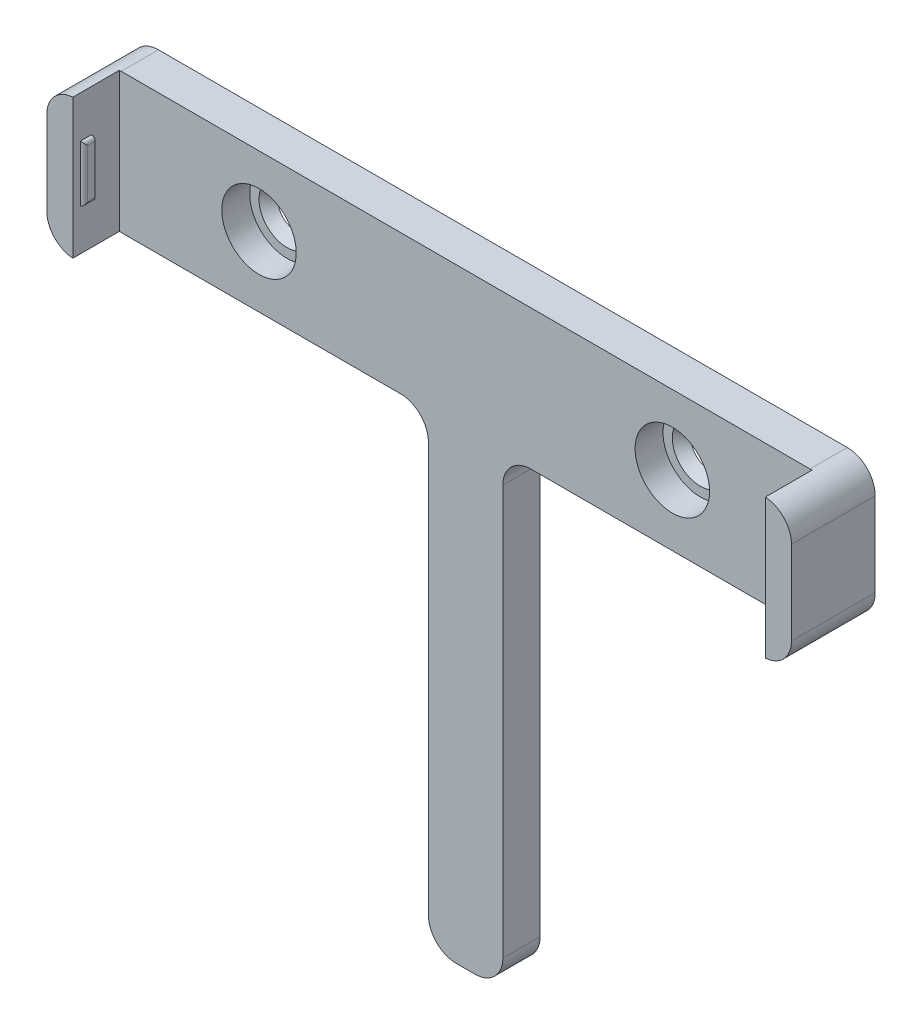
ISO-10303-21;
HEADER;
FILE_DESCRIPTION(('STEP AP214'),'2;1');
FILE_NAME('part.step','',(''),(''),'','','');
FILE_SCHEMA(('AUTOMOTIVE_DESIGN { 1 0 10303 214 1 1 1 1 }'));
ENDSEC;
DATA;
#1=APPLICATION_CONTEXT('core data for automotive mechanical design processes');
#2=APPLICATION_PROTOCOL_DEFINITION('international standard','automotive_design',2000,#1);
#3=PRODUCT_CONTEXT('',#1,'mechanical');
#4=PRODUCT('Part','Part','',(#3));
#5=PRODUCT_RELATED_PRODUCT_CATEGORY('part','',(#4));
#6=PRODUCT_DEFINITION_FORMATION('','',#4);
#7=PRODUCT_DEFINITION_CONTEXT('part definition',#1,'design');
#8=PRODUCT_DEFINITION('design','',#6,#7);
#9=PRODUCT_DEFINITION_SHAPE('','',#8);
#10=(LENGTH_UNIT() NAMED_UNIT(*) SI_UNIT(.MILLI.,.METRE.));
#11=(NAMED_UNIT(*) PLANE_ANGLE_UNIT() SI_UNIT($,.RADIAN.));
#12=(NAMED_UNIT(*) SI_UNIT($,.STERADIAN.) SOLID_ANGLE_UNIT());
#13=UNCERTAINTY_MEASURE_WITH_UNIT(LENGTH_MEASURE(1.E-05),#10,'distance_accuracy_value','');
#14=(GEOMETRIC_REPRESENTATION_CONTEXT(3) GLOBAL_UNCERTAINTY_ASSIGNED_CONTEXT((#13)) GLOBAL_UNIT_ASSIGNED_CONTEXT((#10,
#11,#12)) REPRESENTATION_CONTEXT('',''));
#15=CARTESIAN_POINT('',(0.,0.,0.));
#16=DIRECTION('',(0.,0.,1.));
#17=DIRECTION('',(1.,0.,0.));
#18=AXIS2_PLACEMENT_3D('',#15,#16,#17);
#19=CARTESIAN_POINT('',(0.,0.,4.));
#20=DIRECTION('',(0.,1.,0.));
#21=DIRECTION('',(0.,0.,1.));
#22=AXIS2_PLACEMENT_3D('',#19,#20,#21);
#23=PLANE('',#22);
#24=DIRECTION('',(1.,0.,0.));
#25=VECTOR('',#24,1.);
#26=CARTESIAN_POINT('',(0.,0.,0.));
#27=LINE('',#26,#25);
#28=CARTESIAN_POINT('',(3.,0.,0.));
#29=VERTEX_POINT('',#28);
#30=CARTESIAN_POINT('',(33.,0.,0.));
#31=VERTEX_POINT('',#30);
#32=EDGE_CURVE('E399',#29,#31,#27,.T.);
#33=ORIENTED_EDGE('',*,*,#32,.T.);
#34=DIRECTION('',(0.,0.,-1.));
#35=VECTOR('',#34,1.);
#36=CARTESIAN_POINT('',(33.,0.,4.));
#37=LINE('',#36,#35);
#38=CARTESIAN_POINT('',(33.,0.,4.));
#39=VERTEX_POINT('',#38);
#40=EDGE_CURVE('E302',#31,#39,#37,.F.);
#41=ORIENTED_EDGE('',*,*,#40,.T.);
#42=DIRECTION('',(1.,0.,0.));
#43=VECTOR('',#42,1.);
#44=CARTESIAN_POINT('',(0.,0.,4.));
#45=LINE('',#44,#43);
#46=CARTESIAN_POINT('',(3.,0.,4.));
#47=VERTEX_POINT('',#46);
#48=EDGE_CURVE('E270',#47,#39,#45,.T.);
#49=ORIENTED_EDGE('',*,*,#48,.F.);
#50=DIRECTION('',(0.,0.,-1.));
#51=VECTOR('',#50,1.);
#52=CARTESIAN_POINT('',(3.,0.,4.));
#53=LINE('',#52,#51);
#54=EDGE_CURVE('E269',#47,#29,#53,.T.);
#55=ORIENTED_EDGE('',*,*,#54,.T.);
#56=EDGE_LOOP('',(#33,#41,#49,#55));
#57=FACE_BOUND('',#56,.T.);
#58=ADVANCED_FACE('F33',(#57),#23,.F.);
#59=CARTESIAN_POINT('',(47.,0.,4.));
#60=VERTEX_POINT('',#59);
#61=CARTESIAN_POINT('',(77.,0.,4.));
#62=VERTEX_POINT('',#61);
#63=EDGE_CURVE('E275',#60,#62,#45,.T.);
#64=ORIENTED_EDGE('',*,*,#63,.F.);
#65=DIRECTION('',(0.,0.,-1.));
#66=VECTOR('',#65,1.);
#67=CARTESIAN_POINT('',(47.,0.,0.));
#68=LINE('',#67,#66);
#69=CARTESIAN_POINT('',(47.,0.,0.));
#70=VERTEX_POINT('',#69);
#71=EDGE_CURVE('E299',#60,#70,#68,.T.);
#72=ORIENTED_EDGE('',*,*,#71,.T.);
#73=CARTESIAN_POINT('',(77.,0.,0.));
#74=VERTEX_POINT('',#73);
#75=EDGE_CURVE('E394',#70,#74,#27,.T.);
#76=ORIENTED_EDGE('',*,*,#75,.T.);
#77=DIRECTION('',(0.,0.,-1.));
#78=VECTOR('',#77,1.);
#79=CARTESIAN_POINT('',(77.,0.,4.));
#80=LINE('',#79,#78);
#81=EDGE_CURVE('E584',#74,#62,#80,.F.);
#82=ORIENTED_EDGE('',*,*,#81,.T.);
#83=EDGE_LOOP('',(#64,#72,#76,#82));
#84=FACE_BOUND('',#83,.T.);
#85=ADVANCED_FACE('F459',(#84),#23,.F.);
#86=CARTESIAN_POINT('',(77.2,15.,9.));
#87=DIRECTION('',(1.,0.,0.));
#88=DIRECTION('',(0.,0.,-1.));
#89=AXIS2_PLACEMENT_3D('',#86,#87,#88);
#90=PLANE('',#89);
#91=DIRECTION('',(0.,-1.,0.));
#92=VECTOR('',#91,1.);
#93=CARTESIAN_POINT('',(77.2,15.,4.));
#94=LINE('',#93,#92);
#95=CARTESIAN_POINT('',(77.2,14.9933259094192,4.));
#96=VERTEX_POINT('',#95);
#97=CARTESIAN_POINT('',(77.2,0.00667409058084656,4.));
#98=VERTEX_POINT('',#97);
#99=EDGE_CURVE('E364',#96,#98,#94,.T.);
#100=ORIENTED_EDGE('',*,*,#99,.T.);
#101=DIRECTION('',(0.,0.,-1.));
#102=VECTOR('',#101,1.);
#103=CARTESIAN_POINT('',(77.2,0.00667409058084656,4.));
#104=LINE('',#103,#102);
#105=CARTESIAN_POINT('',(77.2,0.00667409058084743,9.));
#106=VERTEX_POINT('',#105);
#107=EDGE_CURVE('E572',#98,#106,#104,.F.);
#108=ORIENTED_EDGE('',*,*,#107,.T.);
#109=DIRECTION('',(0.,-1.,0.));
#110=VECTOR('',#109,1.);
#111=CARTESIAN_POINT('',(77.2,15.,9.));
#112=LINE('',#111,#110);
#113=CARTESIAN_POINT('',(77.2,14.9933259094192,9.));
#114=VERTEX_POINT('',#113);
#115=EDGE_CURVE('E379',#114,#106,#112,.T.);
#116=ORIENTED_EDGE('',*,*,#115,.F.);
#117=DIRECTION('',(0.,0.,-1.));
#118=VECTOR('',#117,1.);
#119=CARTESIAN_POINT('',(77.2,14.9933259094192,9.));
#120=LINE('',#119,#118);
#121=EDGE_CURVE('E574',#114,#96,#120,.T.);
#122=ORIENTED_EDGE('',*,*,#121,.T.);
#123=EDGE_LOOP('',(#100,#108,#116,#122));
#124=FACE_BOUND('',#123,.T.);
#125=DIRECTION('',(0.,1.,0.));
#126=VECTOR('',#125,1.);
#127=CARTESIAN_POINT('',(77.2,10.5,8.2));
#128=LINE('',#127,#126);
#129=CARTESIAN_POINT('',(77.2,4.5,8.2));
#130=VERTEX_POINT('',#129);
#131=CARTESIAN_POINT('',(77.2,10.5,8.2));
#132=VERTEX_POINT('',#131);
#133=EDGE_CURVE('E219',#130,#132,#128,.T.);
#134=ORIENTED_EDGE('',*,*,#133,.F.);
#135=DIRECTION('',(0.,0.,1.));
#136=VECTOR('',#135,1.);
#137=CARTESIAN_POINT('',(77.2,4.5,8.2));
#138=LINE('',#137,#136);
#139=CARTESIAN_POINT('',(77.2,4.5,7.));
#140=VERTEX_POINT('',#139);
#141=EDGE_CURVE('E223',#140,#130,#138,.T.);
#142=ORIENTED_EDGE('',*,*,#141,.F.);
#143=DIRECTION('',(0.,-1.,0.));
#144=VECTOR('',#143,1.);
#145=CARTESIAN_POINT('',(77.2,10.5,7.));
#146=LINE('',#145,#144);
#147=CARTESIAN_POINT('',(77.2,10.5,7.));
#148=VERTEX_POINT('',#147);
#149=EDGE_CURVE('E242',#148,#140,#146,.T.);
#150=ORIENTED_EDGE('',*,*,#149,.F.);
#151=DIRECTION('',(0.,0.,-1.));
#152=VECTOR('',#151,1.);
#153=CARTESIAN_POINT('',(77.2,10.5,8.2));
#154=LINE('',#153,#152);
#155=EDGE_CURVE('E226',#132,#148,#154,.T.);
#156=ORIENTED_EDGE('',*,*,#155,.F.);
#157=EDGE_LOOP('',(#134,#142,#150,#156));
#158=FACE_BOUND('',#157,.T.);
#159=ADVANCED_FACE('F221',(#124,#158),#90,.F.);
#160=CARTESIAN_POINT('',(2.8,15.,9.));
#161=DIRECTION('',(-1.,0.,0.));
#162=DIRECTION('',(0.,-1.,0.));
#163=AXIS2_PLACEMENT_3D('',#160,#161,#162);
#164=PLANE('',#163);
#165=DIRECTION('',(0.,1.,0.));
#166=VECTOR('',#165,1.);
#167=CARTESIAN_POINT('',(2.8,15.,9.));
#168=LINE('',#167,#166);
#169=CARTESIAN_POINT('',(2.8,0.00667409058084656,9.));
#170=VERTEX_POINT('',#169);
#171=CARTESIAN_POINT('',(2.8,14.9933259094192,9.));
#172=VERTEX_POINT('',#171);
#173=EDGE_CURVE('E387',#170,#172,#168,.T.);
#174=ORIENTED_EDGE('',*,*,#173,.F.);
#175=DIRECTION('',(0.,0.,-1.));
#176=VECTOR('',#175,1.);
#177=CARTESIAN_POINT('',(2.8,0.00667409058084613,9.));
#178=LINE('',#177,#176);
#179=CARTESIAN_POINT('',(2.8,0.00667409058084699,4.));
#180=VERTEX_POINT('',#179);
#181=EDGE_CURVE('E551',#170,#180,#178,.T.);
#182=ORIENTED_EDGE('',*,*,#181,.T.);
#183=DIRECTION('',(0.,1.,0.));
#184=VECTOR('',#183,1.);
#185=CARTESIAN_POINT('',(2.8,15.,4.));
#186=LINE('',#185,#184);
#187=CARTESIAN_POINT('',(2.8,14.9933259094192,4.));
#188=VERTEX_POINT('',#187);
#189=EDGE_CURVE('E382',#180,#188,#186,.T.);
#190=ORIENTED_EDGE('',*,*,#189,.T.);
#191=DIRECTION('',(0.,0.,-1.));
#192=VECTOR('',#191,1.);
#193=CARTESIAN_POINT('',(2.8,14.9933259094192,4.));
#194=LINE('',#193,#192);
#195=EDGE_CURVE('E553',#188,#172,#194,.F.);
#196=ORIENTED_EDGE('',*,*,#195,.T.);
#197=EDGE_LOOP('',(#174,#182,#190,#196));
#198=FACE_BOUND('',#197,.T.);
#199=DIRECTION('',(0.,-1.,0.));
#200=VECTOR('',#199,1.);
#201=CARTESIAN_POINT('',(2.8,4.5,8.2));
#202=LINE('',#201,#200);
#203=CARTESIAN_POINT('',(2.8,10.5,8.2));
#204=VERTEX_POINT('',#203);
#205=CARTESIAN_POINT('',(2.8,4.5,8.2));
#206=VERTEX_POINT('',#205);
#207=EDGE_CURVE('E357',#204,#206,#202,.T.);
#208=ORIENTED_EDGE('',*,*,#207,.F.);
#209=DIRECTION('',(0.,0.,1.));
#210=VECTOR('',#209,1.);
#211=CARTESIAN_POINT('',(2.8,10.5,8.2));
#212=LINE('',#211,#210);
#213=CARTESIAN_POINT('',(2.8,10.5,7.));
#214=VERTEX_POINT('',#213);
#215=EDGE_CURVE('E365',#214,#204,#212,.T.);
#216=ORIENTED_EDGE('',*,*,#215,.F.);
#217=DIRECTION('',(0.,1.,0.));
#218=VECTOR('',#217,1.);
#219=CARTESIAN_POINT('',(2.8,4.5,7.));
#220=LINE('',#219,#218);
#221=CARTESIAN_POINT('',(2.8,4.5,7.));
#222=VERTEX_POINT('',#221);
#223=EDGE_CURVE('E371',#222,#214,#220,.T.);
#224=ORIENTED_EDGE('',*,*,#223,.F.);
#225=DIRECTION('',(0.,0.,-1.));
#226=VECTOR('',#225,1.);
#227=CARTESIAN_POINT('',(2.8,4.5,8.2));
#228=LINE('',#227,#226);
#229=EDGE_CURVE('E368',#206,#222,#228,.T.);
#230=ORIENTED_EDGE('',*,*,#229,.F.);
#231=EDGE_LOOP('',(#208,#216,#224,#230));
#232=FACE_BOUND('',#231,.T.);
#233=ADVANCED_FACE('F447',(#198,#232),#164,.F.);
#234=CARTESIAN_POINT('',(0.,0.,4.));
#235=DIRECTION('',(0.,0.,-1.));
#236=DIRECTION('',(-1.,0.,0.));
#237=AXIS2_PLACEMENT_3D('',#234,#235,#236);
#238=PLANE('',#237);
#239=CARTESIAN_POINT('',(62.2,7.5,4.));
#240=DIRECTION('',(0.,0.,1.));
#241=DIRECTION('',(1.,0.,0.));
#242=AXIS2_PLACEMENT_3D('',#239,#240,#241);
#243=CIRCLE('',#242,4.00000000000001);
#244=CARTESIAN_POINT('',(66.2,7.5,4.));
#245=VERTEX_POINT('',#244);
#246=EDGE_CURVE('E324',#245,#245,#243,.T.);
#247=ORIENTED_EDGE('',*,*,#246,.F.);
#248=EDGE_LOOP('',(#247));
#249=FACE_BOUND('',#248,.T.);
#250=CARTESIAN_POINT('',(17.8,7.5,4.));
#251=DIRECTION('',(0.,0.,1.));
#252=DIRECTION('',(1.,0.,0.));
#253=AXIS2_PLACEMENT_3D('',#250,#251,#252);
#254=CIRCLE('',#253,4.);
#255=CARTESIAN_POINT('',(21.8,7.5,4.));
#256=VERTEX_POINT('',#255);
#257=EDGE_CURVE('E334',#256,#256,#254,.T.);
#258=ORIENTED_EDGE('',*,*,#257,.F.);
#259=EDGE_LOOP('',(#258));
#260=FACE_BOUND('',#259,.T.);
#261=DIRECTION('',(0.,-1.,0.));
#262=VECTOR('',#261,1.);
#263=CARTESIAN_POINT('',(36.,0.,4.));
#264=LINE('',#263,#262);
#265=CARTESIAN_POINT('',(36.,-3.,4.));
#266=VERTEX_POINT('',#265);
#267=CARTESIAN_POINT('',(36.,-47.,4.));
#268=VERTEX_POINT('',#267);
#269=EDGE_CURVE('E342',#266,#268,#264,.T.);
#270=ORIENTED_EDGE('',*,*,#269,.T.);
#271=CARTESIAN_POINT('',(39.,-47.,4.));
#272=DIRECTION('',(0.,0.,-1.));
#273=DIRECTION('',(-1.,0.,0.));
#274=AXIS2_PLACEMENT_3D('',#271,#272,#273);
#275=CIRCLE('',#274,3.);
#276=CARTESIAN_POINT('',(39.,-50.,4.));
#277=VERTEX_POINT('',#276);
#278=EDGE_CURVE('E293',#268,#277,#275,.F.);
#279=ORIENTED_EDGE('',*,*,#278,.T.);
#280=DIRECTION('',(1.,0.,0.));
#281=VECTOR('',#280,1.);
#282=CARTESIAN_POINT('',(36.,-50.,4.));
#283=LINE('',#282,#281);
#284=CARTESIAN_POINT('',(41.,-50.,4.));
#285=VERTEX_POINT('',#284);
#286=EDGE_CURVE('E345',#277,#285,#283,.T.);
#287=ORIENTED_EDGE('',*,*,#286,.T.);
#288=CARTESIAN_POINT('',(41.,-47.,4.));
#289=DIRECTION('',(0.,0.,-1.));
#290=DIRECTION('',(-1.,0.,0.));
#291=AXIS2_PLACEMENT_3D('',#288,#289,#290);
#292=CIRCLE('',#291,3.);
#293=CARTESIAN_POINT('',(44.,-47.,4.));
#294=VERTEX_POINT('',#293);
#295=EDGE_CURVE('E291',#285,#294,#292,.F.);
#296=ORIENTED_EDGE('',*,*,#295,.T.);
#297=DIRECTION('',(0.,1.,0.));
#298=VECTOR('',#297,1.);
#299=CARTESIAN_POINT('',(44.,0.,4.));
#300=LINE('',#299,#298);
#301=CARTESIAN_POINT('',(44.,-3.,4.));
#302=VERTEX_POINT('',#301);
#303=EDGE_CURVE('E250',#294,#302,#300,.T.);
#304=ORIENTED_EDGE('',*,*,#303,.T.);
#305=CARTESIAN_POINT('',(47.,-3.,4.));
#306=DIRECTION('',(0.,0.,-1.));
#307=DIRECTION('',(-1.,0.,0.));
#308=AXIS2_PLACEMENT_3D('',#305,#306,#307);
#309=CIRCLE('',#308,3.);
#310=EDGE_CURVE('E48',#302,#60,#309,.T.);
#311=ORIENTED_EDGE('',*,*,#310,.T.);
#312=ORIENTED_EDGE('',*,*,#63,.T.);
#313=CARTESIAN_POINT('',(77.,3.,4.));
#314=DIRECTION('',(0.,0.,-1.));
#315=DIRECTION('',(-1.,0.,0.));
#316=AXIS2_PLACEMENT_3D('',#313,#314,#315);
#317=CIRCLE('',#316,3.);
#318=EDGE_CURVE('E576',#62,#98,#317,.F.);
#319=ORIENTED_EDGE('',*,*,#318,.T.);
#320=ORIENTED_EDGE('',*,*,#99,.F.);
#321=CARTESIAN_POINT('',(77.,12.,4.));
#322=DIRECTION('',(0.,0.,-1.));
#323=DIRECTION('',(-1.,0.,0.));
#324=AXIS2_PLACEMENT_3D('',#321,#322,#323);
#325=CIRCLE('',#324,3.);
#326=CARTESIAN_POINT('',(77.,15.,4.));
#327=VERTEX_POINT('',#326);
#328=EDGE_CURVE('E578',#96,#327,#325,.F.);
#329=ORIENTED_EDGE('',*,*,#328,.T.);
#330=DIRECTION('',(-1.,0.,0.));
#331=VECTOR('',#330,1.);
#332=CARTESIAN_POINT('',(0.,15.,4.));
#333=LINE('',#332,#331);
#334=CARTESIAN_POINT('',(3.,15.,4.));
#335=VERTEX_POINT('',#334);
#336=EDGE_CURVE('E274',#327,#335,#333,.T.);
#337=ORIENTED_EDGE('',*,*,#336,.T.);
#338=CARTESIAN_POINT('',(3.,12.,4.));
#339=DIRECTION('',(0.,0.,-1.));
#340=DIRECTION('',(-1.,0.,0.));
#341=AXIS2_PLACEMENT_3D('',#338,#339,#340);
#342=CIRCLE('',#341,3.);
#343=EDGE_CURVE('E582',#335,#188,#342,.F.);
#344=ORIENTED_EDGE('',*,*,#343,.T.);
#345=ORIENTED_EDGE('',*,*,#189,.F.);
#346=CARTESIAN_POINT('',(3.,3.,4.));
#347=DIRECTION('',(0.,0.,-1.));
#348=DIRECTION('',(-1.,0.,0.));
#349=AXIS2_PLACEMENT_3D('',#346,#347,#348);
#350=CIRCLE('',#349,3.);
#351=EDGE_CURVE('E580',#180,#47,#350,.F.);
#352=ORIENTED_EDGE('',*,*,#351,.T.);
#353=ORIENTED_EDGE('',*,*,#48,.T.);
#354=CARTESIAN_POINT('',(33.,-3.,4.));
#355=DIRECTION('',(0.,0.,-1.));
#356=DIRECTION('',(-1.,0.,0.));
#357=AXIS2_PLACEMENT_3D('',#354,#355,#356);
#358=CIRCLE('',#357,3.);
#359=EDGE_CURVE('E309',#39,#266,#358,.T.);
#360=ORIENTED_EDGE('',*,*,#359,.T.);
#361=EDGE_LOOP('',(#270,#279,#287,#296,#304,#311,#312,#319,#320,#329,#337,#344,#345,#352,#353,#360));
#362=FACE_BOUND('',#361,.T.);
#363=ADVANCED_FACE('F449',(#249,#260,#362),#238,.F.);
#364=CARTESIAN_POINT('',(0.,0.,4.));
#365=DIRECTION('',(1.,0.,0.));
#366=DIRECTION('',(0.,0.,-1.));
#367=AXIS2_PLACEMENT_3D('',#364,#365,#366);
#368=PLANE('',#367);
#369=DIRECTION('',(0.,-1.,0.));
#370=VECTOR('',#369,1.);
#371=CARTESIAN_POINT('',(0.,0.,0.));
#372=LINE('',#371,#370);
#373=CARTESIAN_POINT('',(0.,12.,0.));
#374=VERTEX_POINT('',#373);
#375=CARTESIAN_POINT('',(0.,3.,0.));
#376=VERTEX_POINT('',#375);
#377=EDGE_CURVE('E389',#374,#376,#372,.T.);
#378=ORIENTED_EDGE('',*,*,#377,.T.);
#379=DIRECTION('',(0.,0.,-1.));
#380=VECTOR('',#379,1.);
#381=CARTESIAN_POINT('',(0.,3.,4.));
#382=LINE('',#381,#380);
#383=CARTESIAN_POINT('',(0.,3.,9.));
#384=VERTEX_POINT('',#383);
#385=EDGE_CURVE('E559',#376,#384,#382,.F.);
#386=ORIENTED_EDGE('',*,*,#385,.T.);
#387=DIRECTION('',(0.,-1.,0.));
#388=VECTOR('',#387,1.);
#389=CARTESIAN_POINT('',(0.,15.,9.));
#390=LINE('',#389,#388);
#391=CARTESIAN_POINT('',(0.,12.,9.));
#392=VERTEX_POINT('',#391);
#393=EDGE_CURVE('E385',#392,#384,#390,.T.);
#394=ORIENTED_EDGE('',*,*,#393,.F.);
#395=DIRECTION('',(0.,0.,-1.));
#396=VECTOR('',#395,1.);
#397=CARTESIAN_POINT('',(0.,12.,4.));
#398=LINE('',#397,#396);
#399=EDGE_CURVE('E561',#392,#374,#398,.T.);
#400=ORIENTED_EDGE('',*,*,#399,.T.);
#401=EDGE_LOOP('',(#378,#386,#394,#400));
#402=FACE_BOUND('',#401,.T.);
#403=ADVANCED_FACE('F456',(#402),#368,.F.);
#404=CARTESIAN_POINT('',(80.,0.,4.));
#405=DIRECTION('',(-1.,0.,0.));
#406=DIRECTION('',(0.,0.,1.));
#407=AXIS2_PLACEMENT_3D('',#404,#405,#406);
#408=PLANE('',#407);
#409=DIRECTION('',(0.,1.,0.));
#410=VECTOR('',#409,1.);
#411=CARTESIAN_POINT('',(80.,15.,9.));
#412=LINE('',#411,#410);
#413=CARTESIAN_POINT('',(80.,3.,9.));
#414=VERTEX_POINT('',#413);
#415=CARTESIAN_POINT('',(80.,12.,9.));
#416=VERTEX_POINT('',#415);
#417=EDGE_CURVE('E376',#414,#416,#412,.T.);
#418=ORIENTED_EDGE('',*,*,#417,.F.);
#419=DIRECTION('',(0.,0.,-1.));
#420=VECTOR('',#419,1.);
#421=CARTESIAN_POINT('',(80.,3.,4.));
#422=LINE('',#421,#420);
#423=CARTESIAN_POINT('',(80.,3.,0.));
#424=VERTEX_POINT('',#423);
#425=EDGE_CURVE('E256',#414,#424,#422,.T.);
#426=ORIENTED_EDGE('',*,*,#425,.T.);
#427=DIRECTION('',(0.,1.,0.));
#428=VECTOR('',#427,1.);
#429=CARTESIAN_POINT('',(80.,0.,0.));
#430=LINE('',#429,#428);
#431=CARTESIAN_POINT('',(80.,12.,0.));
#432=VERTEX_POINT('',#431);
#433=EDGE_CURVE('E403',#424,#432,#430,.T.);
#434=ORIENTED_EDGE('',*,*,#433,.T.);
#435=DIRECTION('',(0.,0.,-1.));
#436=VECTOR('',#435,1.);
#437=CARTESIAN_POINT('',(80.,12.,4.));
#438=LINE('',#437,#436);
#439=EDGE_CURVE('E254',#432,#416,#438,.F.);
#440=ORIENTED_EDGE('',*,*,#439,.T.);
#441=EDGE_LOOP('',(#418,#426,#434,#440));
#442=FACE_BOUND('',#441,.T.);
#443=ADVANCED_FACE('F472',(#442),#408,.F.);
#444=CARTESIAN_POINT('',(0.,15.,4.));
#445=DIRECTION('',(0.,-1.,0.));
#446=DIRECTION('',(0.,0.,-1.));
#447=AXIS2_PLACEMENT_3D('',#444,#445,#446);
#448=PLANE('',#447);
#449=ORIENTED_EDGE('',*,*,#336,.F.);
#450=DIRECTION('',(0.,0.,-1.));
#451=VECTOR('',#450,1.);
#452=CARTESIAN_POINT('',(77.,15.,4.));
#453=LINE('',#452,#451);
#454=CARTESIAN_POINT('',(77.,15.,0.));
#455=VERTEX_POINT('',#454);
#456=EDGE_CURVE('E563',#327,#455,#453,.T.);
#457=ORIENTED_EDGE('',*,*,#456,.T.);
#458=DIRECTION('',(-1.,0.,0.));
#459=VECTOR('',#458,1.);
#460=CARTESIAN_POINT('',(0.,15.,0.));
#461=LINE('',#460,#459);
#462=CARTESIAN_POINT('',(3.,15.,0.));
#463=VERTEX_POINT('',#462);
#464=EDGE_CURVE('E288',#455,#463,#461,.T.);
#465=ORIENTED_EDGE('',*,*,#464,.T.);
#466=DIRECTION('',(0.,0.,-1.));
#467=VECTOR('',#466,1.);
#468=CARTESIAN_POINT('',(3.,15.,4.));
#469=LINE('',#468,#467);
#470=EDGE_CURVE('E566',#463,#335,#469,.F.);
#471=ORIENTED_EDGE('',*,*,#470,.T.);
#472=EDGE_LOOP('',(#449,#457,#465,#471));
#473=FACE_BOUND('',#472,.T.);
#474=ADVANCED_FACE('F626',(#473),#448,.F.);
#475=CARTESIAN_POINT('',(0.,0.,0.));
#476=DIRECTION('',(0.,0.,-1.));
#477=DIRECTION('',(-1.,0.,0.));
#478=AXIS2_PLACEMENT_3D('',#475,#476,#477);
#479=PLANE('',#478);
#480=CARTESIAN_POINT('',(62.2,7.5,0.));
#481=DIRECTION('',(0.,0.,-1.));
#482=DIRECTION('',(-1.,0.,0.));
#483=AXIS2_PLACEMENT_3D('',#480,#481,#482);
#484=CIRCLE('',#483,2.);
#485=CARTESIAN_POINT('',(60.2,7.5,0.));
#486=VERTEX_POINT('',#485);
#487=EDGE_CURVE('E325',#486,#486,#484,.T.);
#488=ORIENTED_EDGE('',*,*,#487,.F.);
#489=EDGE_LOOP('',(#488));
#490=FACE_BOUND('',#489,.T.);
#491=CARTESIAN_POINT('',(17.8,7.5,0.));
#492=DIRECTION('',(0.,0.,-1.));
#493=DIRECTION('',(-1.,0.,0.));
#494=AXIS2_PLACEMENT_3D('',#491,#492,#493);
#495=CIRCLE('',#494,2.);
#496=CARTESIAN_POINT('',(15.8,7.5,0.));
#497=VERTEX_POINT('',#496);
#498=EDGE_CURVE('E322',#497,#497,#495,.T.);
#499=ORIENTED_EDGE('',*,*,#498,.F.);
#500=EDGE_LOOP('',(#499));
#501=FACE_BOUND('',#500,.T.);
#502=DIRECTION('',(1.,0.,0.));
#503=VECTOR('',#502,1.);
#504=CARTESIAN_POINT('',(36.,-50.,0.));
#505=LINE('',#504,#503);
#506=CARTESIAN_POINT('',(39.,-50.,0.));
#507=VERTEX_POINT('',#506);
#508=CARTESIAN_POINT('',(41.,-50.,0.));
#509=VERTEX_POINT('',#508);
#510=EDGE_CURVE('E352',#507,#509,#505,.T.);
#511=ORIENTED_EDGE('',*,*,#510,.F.);
#512=CARTESIAN_POINT('',(39.,-47.,0.));
#513=DIRECTION('',(0.,0.,-1.));
#514=DIRECTION('',(-1.,0.,0.));
#515=AXIS2_PLACEMENT_3D('',#512,#513,#514);
#516=CIRCLE('',#515,3.);
#517=CARTESIAN_POINT('',(36.,-47.,0.));
#518=VERTEX_POINT('',#517);
#519=EDGE_CURVE('E541',#507,#518,#516,.T.);
#520=ORIENTED_EDGE('',*,*,#519,.T.);
#521=DIRECTION('',(0.,-1.,0.));
#522=VECTOR('',#521,1.);
#523=CARTESIAN_POINT('',(36.,0.,0.));
#524=LINE('',#523,#522);
#525=CARTESIAN_POINT('',(36.,-3.,0.));
#526=VERTEX_POINT('',#525);
#527=EDGE_CURVE('E339',#526,#518,#524,.T.);
#528=ORIENTED_EDGE('',*,*,#527,.F.);
#529=CARTESIAN_POINT('',(33.,-3.,0.));
#530=DIRECTION('',(0.,0.,-1.));
#531=DIRECTION('',(-1.,0.,0.));
#532=AXIS2_PLACEMENT_3D('',#529,#530,#531);
#533=CIRCLE('',#532,3.);
#534=EDGE_CURVE('E307',#526,#31,#533,.F.);
#535=ORIENTED_EDGE('',*,*,#534,.T.);
#536=ORIENTED_EDGE('',*,*,#32,.F.);
#537=CARTESIAN_POINT('',(3.,3.,0.));
#538=DIRECTION('',(0.,0.,-1.));
#539=DIRECTION('',(-1.,0.,0.));
#540=AXIS2_PLACEMENT_3D('',#537,#538,#539);
#541=CIRCLE('',#540,3.);
#542=EDGE_CURVE('E262',#29,#376,#541,.T.);
#543=ORIENTED_EDGE('',*,*,#542,.T.);
#544=ORIENTED_EDGE('',*,*,#377,.F.);
#545=CARTESIAN_POINT('',(3.,12.,0.));
#546=DIRECTION('',(0.,0.,-1.));
#547=DIRECTION('',(-1.,0.,0.));
#548=AXIS2_PLACEMENT_3D('',#545,#546,#547);
#549=CIRCLE('',#548,3.);
#550=EDGE_CURVE('E260',#374,#463,#549,.T.);
#551=ORIENTED_EDGE('',*,*,#550,.T.);
#552=ORIENTED_EDGE('',*,*,#464,.F.);
#553=CARTESIAN_POINT('',(77.,12.,0.));
#554=DIRECTION('',(0.,0.,-1.));
#555=DIRECTION('',(-1.,0.,0.));
#556=AXIS2_PLACEMENT_3D('',#553,#554,#555);
#557=CIRCLE('',#556,3.);
#558=EDGE_CURVE('E264',#455,#432,#557,.T.);
#559=ORIENTED_EDGE('',*,*,#558,.T.);
#560=ORIENTED_EDGE('',*,*,#433,.F.);
#561=CARTESIAN_POINT('',(77.,3.,0.));
#562=DIRECTION('',(0.,0.,-1.));
#563=DIRECTION('',(-1.,0.,0.));
#564=AXIS2_PLACEMENT_3D('',#561,#562,#563);
#565=CIRCLE('',#564,3.);
#566=EDGE_CURVE('E266',#424,#74,#565,.T.);
#567=ORIENTED_EDGE('',*,*,#566,.T.);
#568=ORIENTED_EDGE('',*,*,#75,.F.);
#569=CARTESIAN_POINT('',(47.,-3.,0.));
#570=DIRECTION('',(0.,0.,-1.));
#571=DIRECTION('',(-1.,0.,0.));
#572=AXIS2_PLACEMENT_3D('',#569,#570,#571);
#573=CIRCLE('',#572,3.);
#574=CARTESIAN_POINT('',(44.,-3.,0.));
#575=VERTEX_POINT('',#574);
#576=EDGE_CURVE('E304',#70,#575,#573,.F.);
#577=ORIENTED_EDGE('',*,*,#576,.T.);
#578=DIRECTION('',(0.,1.,0.));
#579=VECTOR('',#578,1.);
#580=CARTESIAN_POINT('',(44.,0.,0.));
#581=LINE('',#580,#579);
#582=CARTESIAN_POINT('',(44.,-47.,0.));
#583=VERTEX_POINT('',#582);
#584=EDGE_CURVE('E346',#583,#575,#581,.T.);
#585=ORIENTED_EDGE('',*,*,#584,.F.);
#586=CARTESIAN_POINT('',(41.,-47.,0.));
#587=DIRECTION('',(0.,0.,-1.));
#588=DIRECTION('',(-1.,0.,0.));
#589=AXIS2_PLACEMENT_3D('',#586,#587,#588);
#590=CIRCLE('',#589,3.);
#591=EDGE_CURVE('E542',#583,#509,#590,.T.);
#592=ORIENTED_EDGE('',*,*,#591,.T.);
#593=EDGE_LOOP('',(#511,#520,#528,#535,#536,#543,#544,#551,#552,#559,#560,#567,#568,#577,#585,#592));
#594=FACE_BOUND('',#593,.T.);
#595=ADVANCED_FACE('F597',(#490,#501,#594),#479,.T.);
#596=CARTESIAN_POINT('',(0.,0.,9.));
#597=DIRECTION('',(0.,0.,1.));
#598=DIRECTION('',(1.,0.,0.));
#599=AXIS2_PLACEMENT_3D('',#596,#597,#598);
#600=PLANE('',#599);
#601=ORIENTED_EDGE('',*,*,#393,.T.);
#602=CARTESIAN_POINT('',(3.,3.,9.));
#603=DIRECTION('',(0.,0.,1.));
#604=DIRECTION('',(1.,0.,0.));
#605=AXIS2_PLACEMENT_3D('',#602,#603,#604);
#606=CIRCLE('',#605,3.);
#607=EDGE_CURVE('E555',#384,#170,#606,.T.);
#608=ORIENTED_EDGE('',*,*,#607,.T.);
#609=ORIENTED_EDGE('',*,*,#173,.T.);
#610=CARTESIAN_POINT('',(3.,12.,9.));
#611=DIRECTION('',(0.,0.,1.));
#612=DIRECTION('',(1.,0.,0.));
#613=AXIS2_PLACEMENT_3D('',#610,#611,#612);
#614=CIRCLE('',#613,3.);
#615=EDGE_CURVE('E557',#172,#392,#614,.T.);
#616=ORIENTED_EDGE('',*,*,#615,.T.);
#617=EDGE_LOOP('',(#601,#608,#609,#616));
#618=FACE_BOUND('',#617,.T.);
#619=ADVANCED_FACE('F634',(#618),#600,.T.);
#620=CARTESIAN_POINT('',(0.,0.,9.));
#621=DIRECTION('',(0.,0.,-1.));
#622=DIRECTION('',(-1.,0.,0.));
#623=AXIS2_PLACEMENT_3D('',#620,#621,#622);
#624=PLANE('',#623);
#625=ORIENTED_EDGE('',*,*,#115,.T.);
#626=CARTESIAN_POINT('',(77.,3.,9.));
#627=DIRECTION('',(0.,0.,-1.));
#628=DIRECTION('',(-1.,0.,0.));
#629=AXIS2_PLACEMENT_3D('',#626,#627,#628);
#630=CIRCLE('',#629,3.);
#631=EDGE_CURVE('E568',#106,#414,#630,.F.);
#632=ORIENTED_EDGE('',*,*,#631,.T.);
#633=ORIENTED_EDGE('',*,*,#417,.T.);
#634=CARTESIAN_POINT('',(77.,12.,9.));
#635=DIRECTION('',(0.,0.,-1.));
#636=DIRECTION('',(-1.,0.,0.));
#637=AXIS2_PLACEMENT_3D('',#634,#635,#636);
#638=CIRCLE('',#637,3.);
#639=EDGE_CURVE('E570',#416,#114,#638,.F.);
#640=ORIENTED_EDGE('',*,*,#639,.T.);
#641=EDGE_LOOP('',(#625,#632,#633,#640));
#642=FACE_BOUND('',#641,.T.);
#643=ADVANCED_FACE('F617',(#642),#624,.F.);
#644=CARTESIAN_POINT('',(3.2,4.5,7.));
#645=DIRECTION('',(0.,0.,1.));
#646=DIRECTION('',(1.,0.,0.));
#647=AXIS2_PLACEMENT_3D('',#644,#645,#646);
#648=PLANE('',#647);
#649=ORIENTED_EDGE('',*,*,#223,.T.);
#650=CARTESIAN_POINT('',(2.8,10.1,7.));
#651=DIRECTION('',(0.,0.,1.));
#652=DIRECTION('',(1.,0.,0.));
#653=AXIS2_PLACEMENT_3D('',#650,#651,#652);
#654=CIRCLE('',#653,0.4);
#655=CARTESIAN_POINT('',(3.2,10.1,7.));
#656=VERTEX_POINT('',#655);
#657=EDGE_CURVE('E417',#214,#656,#654,.F.);
#658=ORIENTED_EDGE('',*,*,#657,.T.);
#659=DIRECTION('',(0.,1.,0.));
#660=VECTOR('',#659,1.);
#661=CARTESIAN_POINT('',(3.2,4.5,7.));
#662=LINE('',#661,#660);
#663=CARTESIAN_POINT('',(3.2,4.9,7.));
#664=VERTEX_POINT('',#663);
#665=EDGE_CURVE('E361',#664,#656,#662,.T.);
#666=ORIENTED_EDGE('',*,*,#665,.F.);
#667=CARTESIAN_POINT('',(2.8,4.9,7.));
#668=DIRECTION('',(0.,0.,1.));
#669=DIRECTION('',(1.,0.,0.));
#670=AXIS2_PLACEMENT_3D('',#667,#668,#669);
#671=CIRCLE('',#670,0.4);
#672=EDGE_CURVE('E415',#664,#222,#671,.F.);
#673=ORIENTED_EDGE('',*,*,#672,.T.);
#674=EDGE_LOOP('',(#649,#658,#666,#673));
#675=FACE_BOUND('',#674,.T.);
#676=ADVANCED_FACE('F441',(#675),#648,.F.);
#677=CARTESIAN_POINT('',(3.2,0.,0.));
#678=DIRECTION('',(-1.,0.,0.));
#679=DIRECTION('',(0.,-1.,0.));
#680=AXIS2_PLACEMENT_3D('',#677,#678,#679);
#681=PLANE('',#680);
#682=ORIENTED_EDGE('',*,*,#665,.T.);
#683=DIRECTION('',(0.,0.,1.));
#684=VECTOR('',#683,1.);
#685=CARTESIAN_POINT('',(3.2,10.1,0.));
#686=LINE('',#685,#684);
#687=CARTESIAN_POINT('',(3.2,10.1,7.8));
#688=VERTEX_POINT('',#687);
#689=EDGE_CURVE('E412',#656,#688,#686,.T.);
#690=ORIENTED_EDGE('',*,*,#689,.T.);
#691=DIRECTION('',(0.,-1.,0.));
#692=VECTOR('',#691,1.);
#693=CARTESIAN_POINT('',(3.2,0.,7.8));
#694=LINE('',#693,#692);
#695=CARTESIAN_POINT('',(3.2,4.9,7.8));
#696=VERTEX_POINT('',#695);
#697=EDGE_CURVE('E408',#688,#696,#694,.T.);
#698=ORIENTED_EDGE('',*,*,#697,.T.);
#699=DIRECTION('',(0.,0.,-1.));
#700=VECTOR('',#699,1.);
#701=CARTESIAN_POINT('',(3.2,4.9,0.));
#702=LINE('',#701,#700);
#703=EDGE_CURVE('E410',#696,#664,#702,.T.);
#704=ORIENTED_EDGE('',*,*,#703,.T.);
#705=EDGE_LOOP('',(#682,#690,#698,#704));
#706=FACE_BOUND('',#705,.T.);
#707=ADVANCED_FACE('F438',(#706),#681,.F.);
#708=CARTESIAN_POINT('',(76.8,10.5,7.));
#709=DIRECTION('',(0.,0.,1.));
#710=DIRECTION('',(0.,-1.,0.));
#711=AXIS2_PLACEMENT_3D('',#708,#709,#710);
#712=PLANE('',#711);
#713=DIRECTION('',(0.,-1.,0.));
#714=VECTOR('',#713,1.);
#715=CARTESIAN_POINT('',(76.8,10.5,7.));
#716=LINE('',#715,#714);
#717=CARTESIAN_POINT('',(76.8,10.1,7.));
#718=VERTEX_POINT('',#717);
#719=CARTESIAN_POINT('',(76.8,4.9,7.));
#720=VERTEX_POINT('',#719);
#721=EDGE_CURVE('E241',#718,#720,#716,.T.);
#722=ORIENTED_EDGE('',*,*,#721,.F.);
#723=CARTESIAN_POINT('',(77.2,10.1,7.));
#724=DIRECTION('',(0.,0.,1.));
#725=DIRECTION('',(0.,-1.,0.));
#726=AXIS2_PLACEMENT_3D('',#723,#724,#725);
#727=CIRCLE('',#726,0.4);
#728=EDGE_CURVE('E257',#718,#148,#727,.F.);
#729=ORIENTED_EDGE('',*,*,#728,.T.);
#730=ORIENTED_EDGE('',*,*,#149,.T.);
#731=CARTESIAN_POINT('',(77.2,4.9,7.));
#732=DIRECTION('',(0.,0.,1.));
#733=DIRECTION('',(0.,-1.,0.));
#734=AXIS2_PLACEMENT_3D('',#731,#732,#733);
#735=CIRCLE('',#734,0.4);
#736=EDGE_CURVE('E240',#140,#720,#735,.F.);
#737=ORIENTED_EDGE('',*,*,#736,.T.);
#738=EDGE_LOOP('',(#722,#729,#730,#737));
#739=FACE_BOUND('',#738,.T.);
#740=ADVANCED_FACE('F649',(#739),#712,.F.);
#741=CARTESIAN_POINT('',(76.8,0.,0.));
#742=DIRECTION('',(1.,0.,0.));
#743=DIRECTION('',(0.,0.,-1.));
#744=AXIS2_PLACEMENT_3D('',#741,#742,#743);
#745=PLANE('',#744);
#746=DIRECTION('',(0.,1.,0.));
#747=VECTOR('',#746,1.);
#748=CARTESIAN_POINT('',(76.8,0.,7.8));
#749=LINE('',#748,#747);
#750=CARTESIAN_POINT('',(76.8,4.9,7.8));
#751=VERTEX_POINT('',#750);
#752=CARTESIAN_POINT('',(76.8,10.1,7.8));
#753=VERTEX_POINT('',#752);
#754=EDGE_CURVE('E245',#751,#753,#749,.T.);
#755=ORIENTED_EDGE('',*,*,#754,.T.);
#756=DIRECTION('',(0.,0.,-1.));
#757=VECTOR('',#756,1.);
#758=CARTESIAN_POINT('',(76.8,10.1,0.));
#759=LINE('',#758,#757);
#760=EDGE_CURVE('E422',#753,#718,#759,.T.);
#761=ORIENTED_EDGE('',*,*,#760,.T.);
#762=ORIENTED_EDGE('',*,*,#721,.T.);
#763=DIRECTION('',(0.,0.,1.));
#764=VECTOR('',#763,1.);
#765=CARTESIAN_POINT('',(76.8,4.9,0.));
#766=LINE('',#765,#764);
#767=EDGE_CURVE('E420',#720,#751,#766,.T.);
#768=ORIENTED_EDGE('',*,*,#767,.T.);
#769=EDGE_LOOP('',(#755,#761,#762,#768));
#770=FACE_BOUND('',#769,.T.);
#771=ADVANCED_FACE('F482',(#770),#745,.F.);
#772=CARTESIAN_POINT('',(2.8,4.9,0.));
#773=DIRECTION('',(0.,0.,-1.));
#774=DIRECTION('',(-1.,0.,0.));
#775=AXIS2_PLACEMENT_3D('',#772,#773,#774);
#776=CYLINDRICAL_SURFACE('',#775,0.4);
#777=ORIENTED_EDGE('',*,*,#672,.F.);
#778=ORIENTED_EDGE('',*,*,#703,.F.);
#779=CARTESIAN_POINT('',(2.8,4.9,7.8));
#780=DIRECTION('',(0.,-0.707106781186547,-0.707106781186547));
#781=DIRECTION('',(0.,-0.707106781186547,0.707106781186547));
#782=AXIS2_PLACEMENT_3D('',#779,#780,#781);
#783=ELLIPSE('',#782,0.565685424949238,0.4);
#784=EDGE_CURVE('E231',#206,#696,#783,.F.);
#785=ORIENTED_EDGE('',*,*,#784,.F.);
#786=ORIENTED_EDGE('',*,*,#229,.T.);
#787=EDGE_LOOP('',(#777,#778,#785,#786));
#788=FACE_BOUND('',#787,.T.);
#789=ADVANCED_FACE('F435',(#788),#776,.T.);
#790=CARTESIAN_POINT('',(2.8,0.,7.8));
#791=DIRECTION('',(0.,-1.,0.));
#792=DIRECTION('',(1.,0.,0.));
#793=AXIS2_PLACEMENT_3D('',#790,#791,#792);
#794=CYLINDRICAL_SURFACE('',#793,0.4);
#795=ORIENTED_EDGE('',*,*,#784,.T.);
#796=ORIENTED_EDGE('',*,*,#697,.F.);
#797=CARTESIAN_POINT('',(2.8,10.1,7.8));
#798=DIRECTION('',(0.,-0.707106781186547,0.707106781186547));
#799=DIRECTION('',(0.,-0.707106781186547,-0.707106781186547));
#800=AXIS2_PLACEMENT_3D('',#797,#798,#799);
#801=ELLIPSE('',#800,0.565685424949238,0.4);
#802=EDGE_CURVE('E246',#204,#688,#801,.F.);
#803=ORIENTED_EDGE('',*,*,#802,.F.);
#804=ORIENTED_EDGE('',*,*,#207,.T.);
#805=EDGE_LOOP('',(#795,#796,#803,#804));
#806=FACE_BOUND('',#805,.T.);
#807=ADVANCED_FACE('F430',(#806),#794,.T.);
#808=CARTESIAN_POINT('',(2.8,10.1,0.));
#809=DIRECTION('',(0.,0.,1.));
#810=DIRECTION('',(1.,0.,0.));
#811=AXIS2_PLACEMENT_3D('',#808,#809,#810);
#812=CYLINDRICAL_SURFACE('',#811,0.4);
#813=ORIENTED_EDGE('',*,*,#657,.F.);
#814=ORIENTED_EDGE('',*,*,#215,.T.);
#815=ORIENTED_EDGE('',*,*,#802,.T.);
#816=ORIENTED_EDGE('',*,*,#689,.F.);
#817=EDGE_LOOP('',(#813,#814,#815,#816));
#818=FACE_BOUND('',#817,.T.);
#819=ADVANCED_FACE('F445',(#818),#812,.T.);
#820=CARTESIAN_POINT('',(77.2,4.9,0.));
#821=DIRECTION('',(0.,0.,1.));
#822=DIRECTION('',(1.,0.,0.));
#823=AXIS2_PLACEMENT_3D('',#820,#821,#822);
#824=CYLINDRICAL_SURFACE('',#823,0.4);
#825=ORIENTED_EDGE('',*,*,#736,.F.);
#826=ORIENTED_EDGE('',*,*,#141,.T.);
#827=CARTESIAN_POINT('',(77.2,4.9,7.8));
#828=DIRECTION('',(0.,0.707106781186547,0.707106781186548));
#829=DIRECTION('',(0.,0.707106781186548,-0.707106781186547));
#830=AXIS2_PLACEMENT_3D('',#827,#828,#829);
#831=ELLIPSE('',#830,0.565685424949238,0.4);
#832=EDGE_CURVE('E238',#751,#130,#831,.T.);
#833=ORIENTED_EDGE('',*,*,#832,.F.);
#834=ORIENTED_EDGE('',*,*,#767,.F.);
#835=EDGE_LOOP('',(#825,#826,#833,#834));
#836=FACE_BOUND('',#835,.T.);
#837=ADVANCED_FACE('F236',(#836),#824,.T.);
#838=CARTESIAN_POINT('',(77.2,0.,7.8));
#839=DIRECTION('',(0.,1.,0.));
#840=DIRECTION('',(0.,0.,1.));
#841=AXIS2_PLACEMENT_3D('',#838,#839,#840);
#842=CYLINDRICAL_SURFACE('',#841,0.4);
#843=ORIENTED_EDGE('',*,*,#832,.T.);
#844=ORIENTED_EDGE('',*,*,#133,.T.);
#845=CARTESIAN_POINT('',(77.2,10.1,7.8));
#846=DIRECTION('',(0.,0.707106781186548,-0.707106781186547));
#847=DIRECTION('',(0.,0.707106781186547,0.707106781186548));
#848=AXIS2_PLACEMENT_3D('',#845,#846,#847);
#849=ELLIPSE('',#848,0.565685424949238,0.4);
#850=EDGE_CURVE('E247',#753,#132,#849,.T.);
#851=ORIENTED_EDGE('',*,*,#850,.F.);
#852=ORIENTED_EDGE('',*,*,#754,.F.);
#853=EDGE_LOOP('',(#843,#844,#851,#852));
#854=FACE_BOUND('',#853,.T.);
#855=ADVANCED_FACE('F244',(#854),#842,.T.);
#856=CARTESIAN_POINT('',(77.2,10.1,0.));
#857=DIRECTION('',(0.,0.,-1.));
#858=DIRECTION('',(-1.,0.,0.));
#859=AXIS2_PLACEMENT_3D('',#856,#857,#858);
#860=CYLINDRICAL_SURFACE('',#859,0.4);
#861=ORIENTED_EDGE('',*,*,#850,.T.);
#862=ORIENTED_EDGE('',*,*,#155,.T.);
#863=ORIENTED_EDGE('',*,*,#728,.F.);
#864=ORIENTED_EDGE('',*,*,#760,.F.);
#865=EDGE_LOOP('',(#861,#862,#863,#864));
#866=FACE_BOUND('',#865,.T.);
#867=ADVANCED_FACE('F483',(#866),#860,.T.);
#868=CARTESIAN_POINT('',(77.,3.,4.));
#869=DIRECTION('',(0.,0.,-1.));
#870=DIRECTION('',(-1.,0.,0.));
#871=AXIS2_PLACEMENT_3D('',#868,#869,#870);
#872=CYLINDRICAL_SURFACE('',#871,3.);
#873=ORIENTED_EDGE('',*,*,#318,.F.);
#874=ORIENTED_EDGE('',*,*,#81,.F.);
#875=ORIENTED_EDGE('',*,*,#566,.F.);
#876=ORIENTED_EDGE('',*,*,#425,.F.);
#877=ORIENTED_EDGE('',*,*,#631,.F.);
#878=ORIENTED_EDGE('',*,*,#107,.F.);
#879=EDGE_LOOP('',(#873,#874,#875,#876,#877,#878));
#880=FACE_BOUND('',#879,.T.);
#881=ADVANCED_FACE('F486',(#880),#872,.T.);
#882=CARTESIAN_POINT('',(77.,12.,4.));
#883=DIRECTION('',(0.,0.,-1.));
#884=DIRECTION('',(-1.,0.,0.));
#885=AXIS2_PLACEMENT_3D('',#882,#883,#884);
#886=CYLINDRICAL_SURFACE('',#885,3.);
#887=ORIENTED_EDGE('',*,*,#639,.F.);
#888=ORIENTED_EDGE('',*,*,#439,.F.);
#889=ORIENTED_EDGE('',*,*,#558,.F.);
#890=ORIENTED_EDGE('',*,*,#456,.F.);
#891=ORIENTED_EDGE('',*,*,#328,.F.);
#892=ORIENTED_EDGE('',*,*,#121,.F.);
#893=EDGE_LOOP('',(#887,#888,#889,#890,#891,#892));
#894=FACE_BOUND('',#893,.T.);
#895=ADVANCED_FACE('F494',(#894),#886,.T.);
#896=CARTESIAN_POINT('',(3.,3.,4.));
#897=DIRECTION('',(0.,0.,-1.));
#898=DIRECTION('',(-1.,0.,0.));
#899=AXIS2_PLACEMENT_3D('',#896,#897,#898);
#900=CYLINDRICAL_SURFACE('',#899,3.);
#901=ORIENTED_EDGE('',*,*,#607,.F.);
#902=ORIENTED_EDGE('',*,*,#385,.F.);
#903=ORIENTED_EDGE('',*,*,#542,.F.);
#904=ORIENTED_EDGE('',*,*,#54,.F.);
#905=ORIENTED_EDGE('',*,*,#351,.F.);
#906=ORIENTED_EDGE('',*,*,#181,.F.);
#907=EDGE_LOOP('',(#901,#902,#903,#904,#905,#906));
#908=FACE_BOUND('',#907,.T.);
#909=ADVANCED_FACE('F498',(#908),#900,.T.);
#910=CARTESIAN_POINT('',(3.,12.,4.));
#911=DIRECTION('',(0.,0.,-1.));
#912=DIRECTION('',(-1.,0.,0.));
#913=AXIS2_PLACEMENT_3D('',#910,#911,#912);
#914=CYLINDRICAL_SURFACE('',#913,3.);
#915=ORIENTED_EDGE('',*,*,#343,.F.);
#916=ORIENTED_EDGE('',*,*,#470,.F.);
#917=ORIENTED_EDGE('',*,*,#550,.F.);
#918=ORIENTED_EDGE('',*,*,#399,.F.);
#919=ORIENTED_EDGE('',*,*,#615,.F.);
#920=ORIENTED_EDGE('',*,*,#195,.F.);
#921=EDGE_LOOP('',(#915,#916,#917,#918,#919,#920));
#922=FACE_BOUND('',#921,.T.);
#923=ADVANCED_FACE('F502',(#922),#914,.T.);
#924=CARTESIAN_POINT('',(36.,0.,4.));
#925=DIRECTION('',(1.,0.,0.));
#926=DIRECTION('',(0.,1.,0.));
#927=AXIS2_PLACEMENT_3D('',#924,#925,#926);
#928=PLANE('',#927);
#929=ORIENTED_EDGE('',*,*,#527,.T.);
#930=DIRECTION('',(0.,0.,-1.));
#931=VECTOR('',#930,1.);
#932=CARTESIAN_POINT('',(36.,-47.,4.));
#933=LINE('',#932,#931);
#934=EDGE_CURVE('E289',#518,#268,#933,.F.);
#935=ORIENTED_EDGE('',*,*,#934,.T.);
#936=ORIENTED_EDGE('',*,*,#269,.F.);
#937=DIRECTION('',(0.,0.,-1.));
#938=VECTOR('',#937,1.);
#939=CARTESIAN_POINT('',(36.,-3.,0.));
#940=LINE('',#939,#938);
#941=EDGE_CURVE('E534',#266,#526,#940,.T.);
#942=ORIENTED_EDGE('',*,*,#941,.T.);
#943=EDGE_LOOP('',(#929,#935,#936,#942));
#944=FACE_BOUND('',#943,.T.);
#945=ADVANCED_FACE('F506',(#944),#928,.F.);
#946=CARTESIAN_POINT('',(36.,-50.,4.));
#947=DIRECTION('',(0.,1.,0.));
#948=DIRECTION('',(0.,0.,1.));
#949=AXIS2_PLACEMENT_3D('',#946,#947,#948);
#950=PLANE('',#949);
#951=ORIENTED_EDGE('',*,*,#286,.F.);
#952=DIRECTION('',(0.,0.,-1.));
#953=VECTOR('',#952,1.);
#954=CARTESIAN_POINT('',(39.,-50.,4.));
#955=LINE('',#954,#953);
#956=EDGE_CURVE('E546',#277,#507,#955,.T.);
#957=ORIENTED_EDGE('',*,*,#956,.T.);
#958=ORIENTED_EDGE('',*,*,#510,.T.);
#959=DIRECTION('',(0.,0.,-1.));
#960=VECTOR('',#959,1.);
#961=CARTESIAN_POINT('',(41.,-50.,4.));
#962=LINE('',#961,#960);
#963=EDGE_CURVE('E549',#509,#285,#962,.F.);
#964=ORIENTED_EDGE('',*,*,#963,.T.);
#965=EDGE_LOOP('',(#951,#957,#958,#964));
#966=FACE_BOUND('',#965,.T.);
#967=ADVANCED_FACE('F601',(#966),#950,.F.);
#968=CARTESIAN_POINT('',(44.,0.,4.));
#969=DIRECTION('',(-1.,0.,0.));
#970=DIRECTION('',(0.,-1.,0.));
#971=AXIS2_PLACEMENT_3D('',#968,#969,#970);
#972=PLANE('',#971);
#973=ORIENTED_EDGE('',*,*,#303,.F.);
#974=DIRECTION('',(0.,0.,-1.));
#975=VECTOR('',#974,1.);
#976=CARTESIAN_POINT('',(44.,-47.,4.));
#977=LINE('',#976,#975);
#978=EDGE_CURVE('E296',#294,#583,#977,.T.);
#979=ORIENTED_EDGE('',*,*,#978,.T.);
#980=ORIENTED_EDGE('',*,*,#584,.T.);
#981=DIRECTION('',(0.,0.,-1.));
#982=VECTOR('',#981,1.);
#983=CARTESIAN_POINT('',(44.,-3.,4.));
#984=LINE('',#983,#982);
#985=EDGE_CURVE('E56',#575,#302,#984,.F.);
#986=ORIENTED_EDGE('',*,*,#985,.T.);
#987=EDGE_LOOP('',(#973,#979,#980,#986));
#988=FACE_BOUND('',#987,.T.);
#989=ADVANCED_FACE('F512',(#988),#972,.F.);
#990=CARTESIAN_POINT('',(39.,-47.,4.));
#991=DIRECTION('',(0.,0.,-1.));
#992=DIRECTION('',(-1.,0.,0.));
#993=AXIS2_PLACEMENT_3D('',#990,#991,#992);
#994=CYLINDRICAL_SURFACE('',#993,3.);
#995=ORIENTED_EDGE('',*,*,#278,.F.);
#996=ORIENTED_EDGE('',*,*,#934,.F.);
#997=ORIENTED_EDGE('',*,*,#519,.F.);
#998=ORIENTED_EDGE('',*,*,#956,.F.);
#999=EDGE_LOOP('',(#995,#996,#997,#998));
#1000=FACE_BOUND('',#999,.T.);
#1001=ADVANCED_FACE('F508',(#1000),#994,.T.);
#1002=CARTESIAN_POINT('',(41.,-47.,4.));
#1003=DIRECTION('',(0.,0.,-1.));
#1004=DIRECTION('',(-1.,0.,0.));
#1005=AXIS2_PLACEMENT_3D('',#1002,#1003,#1004);
#1006=CYLINDRICAL_SURFACE('',#1005,3.);
#1007=ORIENTED_EDGE('',*,*,#295,.F.);
#1008=ORIENTED_EDGE('',*,*,#963,.F.);
#1009=ORIENTED_EDGE('',*,*,#591,.F.);
#1010=ORIENTED_EDGE('',*,*,#978,.F.);
#1011=EDGE_LOOP('',(#1007,#1008,#1009,#1010));
#1012=FACE_BOUND('',#1011,.T.);
#1013=ADVANCED_FACE('F511',(#1012),#1006,.T.);
#1014=CARTESIAN_POINT('',(47.,-3.,4.));
#1015=DIRECTION('',(0.,0.,1.));
#1016=DIRECTION('',(1.,0.,0.));
#1017=AXIS2_PLACEMENT_3D('',#1014,#1015,#1016);
#1018=CYLINDRICAL_SURFACE('',#1017,3.);
#1019=ORIENTED_EDGE('',*,*,#310,.F.);
#1020=ORIENTED_EDGE('',*,*,#985,.F.);
#1021=ORIENTED_EDGE('',*,*,#576,.F.);
#1022=ORIENTED_EDGE('',*,*,#71,.F.);
#1023=EDGE_LOOP('',(#1019,#1020,#1021,#1022));
#1024=FACE_BOUND('',#1023,.T.);
#1025=ADVANCED_FACE('F516',(#1024),#1018,.F.);
#1026=CARTESIAN_POINT('',(33.,-3.,4.));
#1027=DIRECTION('',(0.,0.,1.));
#1028=DIRECTION('',(1.,0.,0.));
#1029=AXIS2_PLACEMENT_3D('',#1026,#1027,#1028);
#1030=CYLINDRICAL_SURFACE('',#1029,3.);
#1031=ORIENTED_EDGE('',*,*,#359,.F.);
#1032=ORIENTED_EDGE('',*,*,#40,.F.);
#1033=ORIENTED_EDGE('',*,*,#534,.F.);
#1034=ORIENTED_EDGE('',*,*,#941,.F.);
#1035=EDGE_LOOP('',(#1031,#1032,#1033,#1034));
#1036=FACE_BOUND('',#1035,.T.);
#1037=ADVANCED_FACE('F520',(#1036),#1030,.F.);
#1038=CARTESIAN_POINT('',(17.8,7.5,1.));
#1039=DIRECTION('',(0.,0.,1.));
#1040=DIRECTION('',(1.,0.,0.));
#1041=AXIS2_PLACEMENT_3D('',#1038,#1039,#1040);
#1042=CYLINDRICAL_SURFACE('',#1041,4.);
#1043=CARTESIAN_POINT('',(17.8,7.5,1.));
#1044=DIRECTION('',(0.,0.,1.));
#1045=DIRECTION('',(1.,0.,0.));
#1046=AXIS2_PLACEMENT_3D('',#1043,#1044,#1045);
#1047=CIRCLE('',#1046,4.);
#1048=CARTESIAN_POINT('',(21.8,7.5,1.));
#1049=VERTEX_POINT('',#1048);
#1050=EDGE_CURVE('E336',#1049,#1049,#1047,.T.);
#1051=ORIENTED_EDGE('',*,*,#1050,.F.);
#1052=EDGE_LOOP('',(#1051));
#1053=FACE_BOUND('',#1052,.T.);
#1054=ORIENTED_EDGE('',*,*,#257,.T.);
#1055=EDGE_LOOP('',(#1054));
#1056=FACE_BOUND('',#1055,.T.);
#1057=ADVANCED_FACE('F523',(#1053,#1056),#1042,.F.);
#1058=CARTESIAN_POINT('',(17.8,7.5,1.));
#1059=DIRECTION('',(0.,0.,1.));
#1060=DIRECTION('',(1.,0.,0.));
#1061=AXIS2_PLACEMENT_3D('',#1058,#1059,#1060);
#1062=PLANE('',#1061);
#1063=CARTESIAN_POINT('',(17.8,7.5,1.));
#1064=DIRECTION('',(0.,0.,1.));
#1065=DIRECTION('',(1.,0.,0.));
#1066=AXIS2_PLACEMENT_3D('',#1063,#1064,#1065);
#1067=CIRCLE('',#1066,3.00000000000001);
#1068=CARTESIAN_POINT('',(20.8,7.5,1.));
#1069=VERTEX_POINT('',#1068);
#1070=EDGE_CURVE('E41',#1069,#1069,#1067,.F.);
#1071=ORIENTED_EDGE('',*,*,#1070,.T.);
#1072=EDGE_LOOP('',(#1071));
#1073=FACE_BOUND('',#1072,.T.);
#1074=ORIENTED_EDGE('',*,*,#1050,.T.);
#1075=EDGE_LOOP('',(#1074));
#1076=FACE_BOUND('',#1075,.T.);
#1077=ADVANCED_FACE('F313',(#1073,#1076),#1062,.T.);
#1078=CARTESIAN_POINT('',(62.2,7.5,1.));
#1079=DIRECTION('',(0.,0.,1.));
#1080=DIRECTION('',(1.,0.,0.));
#1081=AXIS2_PLACEMENT_3D('',#1078,#1079,#1080);
#1082=CYLINDRICAL_SURFACE('',#1081,4.00000000000001);
#1083=CARTESIAN_POINT('',(62.2,7.5,1.));
#1084=DIRECTION('',(0.,0.,1.));
#1085=DIRECTION('',(1.,0.,0.));
#1086=AXIS2_PLACEMENT_3D('',#1083,#1084,#1085);
#1087=CIRCLE('',#1086,4.00000000000001);
#1088=CARTESIAN_POINT('',(66.2,7.5,1.));
#1089=VERTEX_POINT('',#1088);
#1090=EDGE_CURVE('E328',#1089,#1089,#1087,.T.);
#1091=ORIENTED_EDGE('',*,*,#1090,.F.);
#1092=EDGE_LOOP('',(#1091));
#1093=FACE_BOUND('',#1092,.T.);
#1094=ORIENTED_EDGE('',*,*,#246,.T.);
#1095=EDGE_LOOP('',(#1094));
#1096=FACE_BOUND('',#1095,.T.);
#1097=ADVANCED_FACE('F664',(#1093,#1096),#1082,.F.);
#1098=CARTESIAN_POINT('',(62.2,7.5,1.));
#1099=DIRECTION('',(0.,0.,1.));
#1100=DIRECTION('',(1.,0.,0.));
#1101=AXIS2_PLACEMENT_3D('',#1098,#1099,#1100);
#1102=PLANE('',#1101);
#1103=CARTESIAN_POINT('',(62.2,7.5,1.));
#1104=DIRECTION('',(0.,0.,1.));
#1105=DIRECTION('',(1.,0.,0.));
#1106=AXIS2_PLACEMENT_3D('',#1103,#1104,#1105);
#1107=CIRCLE('',#1106,2.99999999999998);
#1108=CARTESIAN_POINT('',(65.2,7.5,1.));
#1109=VERTEX_POINT('',#1108);
#1110=EDGE_CURVE('E11',#1109,#1109,#1107,.F.);
#1111=ORIENTED_EDGE('',*,*,#1110,.T.);
#1112=EDGE_LOOP('',(#1111));
#1113=FACE_BOUND('',#1112,.T.);
#1114=ORIENTED_EDGE('',*,*,#1090,.T.);
#1115=EDGE_LOOP('',(#1114));
#1116=FACE_BOUND('',#1115,.T.);
#1117=ADVANCED_FACE('F319',(#1113,#1116),#1102,.T.);
#1118=CARTESIAN_POINT('',(17.8,7.5,0.));
#1119=DIRECTION('',(0.,0.,1.));
#1120=DIRECTION('',(1.,0.,0.));
#1121=AXIS2_PLACEMENT_3D('',#1118,#1119,#1120);
#1122=CONICAL_SURFACE('',#1121,2.,0.785398163397453);
#1123=ORIENTED_EDGE('',*,*,#1070,.F.);
#1124=EDGE_LOOP('',(#1123));
#1125=FACE_BOUND('',#1124,.T.);
#1126=ORIENTED_EDGE('',*,*,#498,.T.);
#1127=EDGE_LOOP('',(#1126));
#1128=FACE_BOUND('',#1127,.T.);
#1129=ADVANCED_FACE('F316',(#1125,#1128),#1122,.F.);
#1130=CARTESIAN_POINT('',(62.2,7.5,0.));
#1131=DIRECTION('',(0.,0.,1.));
#1132=DIRECTION('',(1.,0.,0.));
#1133=AXIS2_PLACEMENT_3D('',#1130,#1131,#1132);
#1134=CONICAL_SURFACE('',#1133,2.,0.785398163397452);
#1135=ORIENTED_EDGE('',*,*,#1110,.F.);
#1136=EDGE_LOOP('',(#1135));
#1137=FACE_BOUND('',#1136,.T.);
#1138=ORIENTED_EDGE('',*,*,#487,.T.);
#1139=EDGE_LOOP('',(#1138));
#1140=FACE_BOUND('',#1139,.T.);
#1141=ADVANCED_FACE('F35',(#1137,#1140),#1134,.F.);
#1142=CLOSED_SHELL('',(#58,#85,#159,#233,#363,#403,#443,#474,#595,#619,#643,#676,#707,#740,#771,
#789,#807,#819,#837,#855,#867,#881,#895,#909,#923,#945,#967,#989,#1001,#1013,#1025,#1037,#1057,
#1077,#1097,#1117,#1129,#1141));
#1143=MANIFOLD_SOLID_BREP('B2',#1142);
#1144=ADVANCED_BREP_SHAPE_REPRESENTATION('',(#18,#1143),#14);
#1145=SHAPE_DEFINITION_REPRESENTATION(#9,#1144);
ENDSEC;
END-ISO-10303-21;
